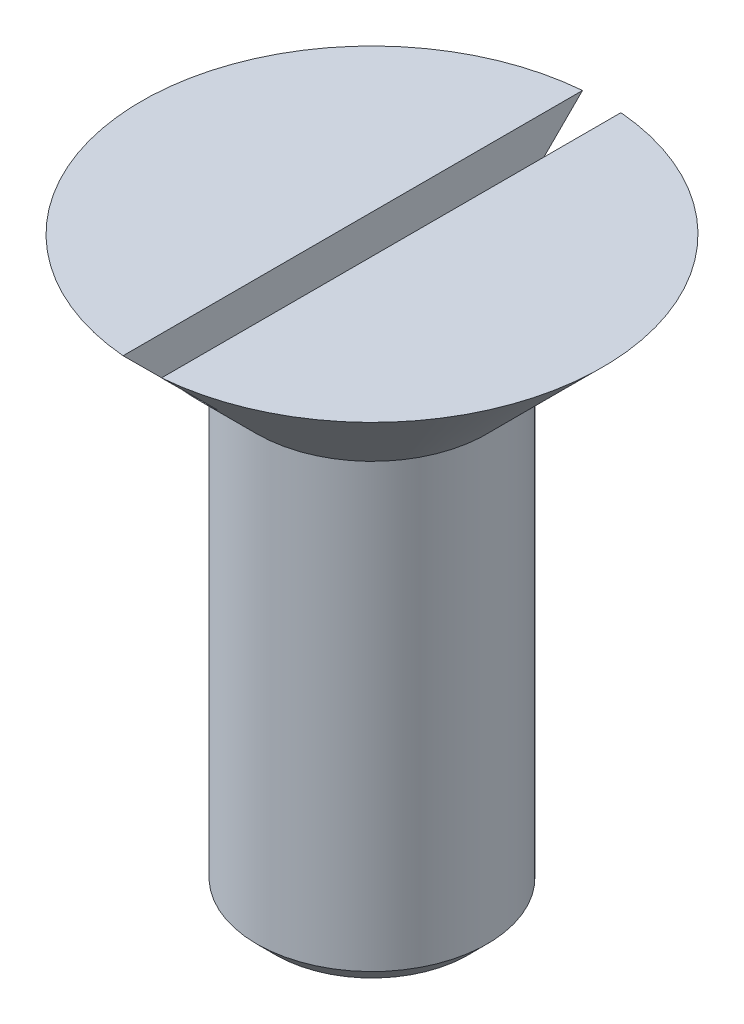
ISO-10303-21;
HEADER;
FILE_DESCRIPTION(('STEP AP214'),'2;1');
FILE_NAME('part.step','',(''),(''),'','','');
FILE_SCHEMA(('AUTOMOTIVE_DESIGN { 1 0 10303 214 1 1 1 1 }'));
ENDSEC;
DATA;
#1=APPLICATION_CONTEXT('core data for automotive mechanical design processes');
#2=APPLICATION_PROTOCOL_DEFINITION('international standard','automotive_design',2000,#1);
#3=PRODUCT_CONTEXT('',#1,'mechanical');
#4=PRODUCT('Part','Part','',(#3));
#5=PRODUCT_RELATED_PRODUCT_CATEGORY('part','',(#4));
#6=PRODUCT_DEFINITION_FORMATION('','',#4);
#7=PRODUCT_DEFINITION_CONTEXT('part definition',#1,'design');
#8=PRODUCT_DEFINITION('design','',#6,#7);
#9=PRODUCT_DEFINITION_SHAPE('','',#8);
#10=(LENGTH_UNIT() NAMED_UNIT(*) SI_UNIT(.MILLI.,.METRE.));
#11=(NAMED_UNIT(*) PLANE_ANGLE_UNIT() SI_UNIT($,.RADIAN.));
#12=(NAMED_UNIT(*) SI_UNIT($,.STERADIAN.) SOLID_ANGLE_UNIT());
#13=UNCERTAINTY_MEASURE_WITH_UNIT(LENGTH_MEASURE(1.E-05),#10,'distance_accuracy_value','');
#14=(GEOMETRIC_REPRESENTATION_CONTEXT(3) GLOBAL_UNCERTAINTY_ASSIGNED_CONTEXT((#13)) GLOBAL_UNIT_ASSIGNED_CONTEXT((#10,
#11,#12)) REPRESENTATION_CONTEXT('',''));
#15=CARTESIAN_POINT('',(0.,0.,0.));
#16=DIRECTION('',(0.,0.,1.));
#17=DIRECTION('',(1.,0.,0.));
#18=AXIS2_PLACEMENT_3D('',#15,#16,#17);
#19=CARTESIAN_POINT('',(12.,30.,0.));
#20=DIRECTION('',(0.,-1.,0.));
#21=DIRECTION('',(0.,0.,-1.));
#22=AXIS2_PLACEMENT_3D('',#19,#20,#21);
#23=PLANE('',#22);
#24=CARTESIAN_POINT('',(0.,30.,0.));
#25=DIRECTION('',(0.,1.,0.));
#26=DIRECTION('',(0.,0.,1.));
#27=AXIS2_PLACEMENT_3D('',#24,#25,#26);
#28=CIRCLE('',#27,12.);
#29=CARTESIAN_POINT('',(1.,30.,11.9582607431014));
#30=VERTEX_POINT('',#29);
#31=CARTESIAN_POINT('',(1.,30.,-11.9582607431014));
#32=VERTEX_POINT('',#31);
#33=EDGE_CURVE('E138',#30,#32,#28,.T.);
#34=ORIENTED_EDGE('',*,*,#33,.T.);
#35=DIRECTION('',(0.,0.,1.));
#36=VECTOR('',#35,1.);
#37=CARTESIAN_POINT('',(1.,30.,0.));
#38=LINE('',#37,#36);
#39=EDGE_CURVE('E139',#32,#30,#38,.T.);
#40=ORIENTED_EDGE('',*,*,#39,.T.);
#41=EDGE_LOOP('',(#34,#40));
#42=FACE_BOUND('',#41,.T.);
#43=ADVANCED_FACE('F37',(#42),#23,.F.);
#44=CARTESIAN_POINT('',(0.,0.,0.));
#45=DIRECTION('',(0.,1.,0.));
#46=DIRECTION('',(0.,0.,1.));
#47=AXIS2_PLACEMENT_3D('',#44,#45,#46);
#48=PLANE('',#47);
#49=CARTESIAN_POINT('',(0.,0.,0.));
#50=DIRECTION('',(0.,1.,0.));
#51=DIRECTION('',(0.,0.,1.));
#52=AXIS2_PLACEMENT_3D('',#49,#50,#51);
#53=CIRCLE('',#52,5.);
#54=CARTESIAN_POINT('',(0.,0.,5.));
#55=VERTEX_POINT('',#54);
#56=EDGE_CURVE('E147',#55,#55,#53,.T.);
#57=ORIENTED_EDGE('',*,*,#56,.F.);
#58=EDGE_LOOP('',(#57));
#59=FACE_BOUND('',#58,.T.);
#60=ADVANCED_FACE('F39',(#59),#48,.F.);
#61=CARTESIAN_POINT('',(0.,0.,0.));
#62=DIRECTION('',(0.,1.,0.));
#63=DIRECTION('',(0.,0.,1.));
#64=AXIS2_PLACEMENT_3D('',#61,#62,#63);
#65=CONICAL_SURFACE('',#64,5.,0.78539816339745);
#66=CARTESIAN_POINT('',(0.,0.999999999999997,0.));
#67=DIRECTION('',(0.,1.,0.));
#68=DIRECTION('',(0.,0.,1.));
#69=AXIS2_PLACEMENT_3D('',#66,#67,#68);
#70=CIRCLE('',#69,6.);
#71=CARTESIAN_POINT('',(0.,0.999999999999997,6.));
#72=VERTEX_POINT('',#71);
#73=EDGE_CURVE('E142',#72,#72,#70,.T.);
#74=ORIENTED_EDGE('',*,*,#73,.F.);
#75=EDGE_LOOP('',(#74));
#76=FACE_BOUND('',#75,.T.);
#77=ORIENTED_EDGE('',*,*,#56,.T.);
#78=EDGE_LOOP('',(#77));
#79=FACE_BOUND('',#78,.T.);
#80=ADVANCED_FACE('F134',(#76,#79),#65,.T.);
#81=CARTESIAN_POINT('',(0.,23.3312882009808,0.));
#82=DIRECTION('',(0.,1.,0.));
#83=DIRECTION('',(0.,0.,1.));
#84=AXIS2_PLACEMENT_3D('',#81,#82,#83);
#85=CYLINDRICAL_SURFACE('',#84,6.);
#86=CARTESIAN_POINT('',(0.,24.,0.));
#87=DIRECTION('',(0.,1.,0.));
#88=DIRECTION('',(0.,0.,1.));
#89=AXIS2_PLACEMENT_3D('',#86,#87,#88);
#90=CIRCLE('',#89,6.);
#91=CARTESIAN_POINT('',(0.,24.,6.));
#92=VERTEX_POINT('',#91);
#93=EDGE_CURVE('E140',#92,#92,#90,.T.);
#94=ORIENTED_EDGE('',*,*,#93,.F.);
#95=EDGE_LOOP('',(#94));
#96=FACE_BOUND('',#95,.T.);
#97=ORIENTED_EDGE('',*,*,#73,.T.);
#98=EDGE_LOOP('',(#97));
#99=FACE_BOUND('',#98,.T.);
#100=ADVANCED_FACE('F127',(#96,#99),#85,.T.);
#101=CARTESIAN_POINT('',(0.,24.,0.));
#102=DIRECTION('',(0.,1.,0.));
#103=DIRECTION('',(0.,0.,1.));
#104=AXIS2_PLACEMENT_3D('',#101,#102,#103);
#105=CONICAL_SURFACE('',#104,6.,0.785398163397449);
#106=CARTESIAN_POINT('',(0.,26.9999999999999,0.));
#107=DIRECTION('',(0.,-1.,0.));
#108=DIRECTION('',(0.,0.,-1.));
#109=AXIS2_PLACEMENT_3D('',#106,#107,#108);
#110=CIRCLE('',#109,8.99999999999995);
#111=CARTESIAN_POINT('',(-0.999999999999996,26.9999999999999,-8.94427190999911));
#112=VERTEX_POINT('',#111);
#113=CARTESIAN_POINT('',(1.,26.9999999999999,-8.94427190999911));
#114=VERTEX_POINT('',#113);
#115=EDGE_CURVE('E11',#112,#114,#110,.T.);
#116=ORIENTED_EDGE('',*,*,#115,.T.);
#117=CARTESIAN_POINT('',(1.,44.5122639469374,26.4933980378523));
#118=CARTESIAN_POINT('',(1.,43.5940673393234,25.5745422624374));
#119=CARTESIAN_POINT('',(1.,42.6758997049582,24.6556575279848));
#120=CARTESIAN_POINT('',(1.,40.8396582708122,22.8177903113004));
#121=CARTESIAN_POINT('',(1.,39.9215844712401,21.8988078288601));
#122=CARTESIAN_POINT('',(1.,38.0855245788476,20.0606632205416));
#123=CARTESIAN_POINT('',(1.,37.16753849273,19.1415010879679));
#124=CARTESIAN_POINT('',(1.,35.3317733412843,17.3029739988937));
#125=CARTESIAN_POINT('',(1.,34.4139942755214,16.3836090428273));
#126=CARTESIAN_POINT('',(1.,32.585570047651,14.5513709514414));
#127=CARTESIAN_POINT('',(1.,31.6749224586648,13.6385002384581));
#128=CARTESIAN_POINT('',(1.,30.3093881661313,12.2687524419226));
#129=CARTESIAN_POINT('',(1.,29.8542814312295,11.8120947295176));
#130=CARTESIAN_POINT('',(1.,28.9442781069952,10.8985705407463));
#131=CARTESIAN_POINT('',(1.,28.4893815175277,10.4417040645145));
#132=CARTESIAN_POINT('',(1.,27.5799074902484,9.52768153636842));
#133=CARTESIAN_POINT('',(1.,27.125330043018,9.0705254938286));
#134=CARTESIAN_POINT('',(1.,26.2166490205943,8.15574043477165));
#135=CARTESIAN_POINT('',(1.,25.7625454465733,7.69811141708995));
#136=CARTESIAN_POINT('',(1.,24.8551207880647,6.78208768874798));
#137=CARTESIAN_POINT('',(1.,24.4017996947011,6.32369298689074));
#138=CARTESIAN_POINT('',(1.,23.7229266085605,5.63500968466589));
#139=CARTESIAN_POINT('',(1.,23.4968207902504,5.40526716991698));
#140=CARTESIAN_POINT('',(1.,23.0451520235052,4.94524928125385));
#141=CARTESIAN_POINT('',(1.,22.8195890742807,4.71497390811529));
#142=CARTESIAN_POINT('',(1.,22.4708088310656,4.35762342812966));
#143=CARTESIAN_POINT('',(1.,22.3473017521385,4.23083122805373));
#144=CARTESIAN_POINT('',(1.,22.1006154097381,3.97692756318102));
#145=CARTESIAN_POINT('',(1.,21.9774361471552,3.84981609751893));
#146=CARTESIAN_POINT('',(1.,21.731383489774,3.59504120353356));
#147=CARTESIAN_POINT('',(1.,21.6085105466701,3.46737733846819));
#148=CARTESIAN_POINT('',(1.,21.3633663120308,3.21147487829868));
#149=CARTESIAN_POINT('',(1.,21.241095016984,3.08323628655735));
#150=CARTESIAN_POINT('',(1.,20.9560567371705,2.78233435743568));
#151=CARTESIAN_POINT('',(1.,20.793620767391,2.60935587365856));
#152=CARTESIAN_POINT('',(1.,20.5520854233645,2.3482357162741));
#153=CARTESIAN_POINT('',(1.,20.4720029781814,2.26100520027151));
#154=CARTESIAN_POINT('',(1.,20.3127603456745,2.08571310966559));
#155=CARTESIAN_POINT('',(1.,20.2336001238385,1.99765156638628));
#156=CARTESIAN_POINT('',(1.,20.0499836197682,1.79039743677013));
#157=CARTESIAN_POINT('',(1.,19.9460309566567,1.67075323436282));
#158=CARTESIAN_POINT('',(1.,19.7928293403971,1.48839131247664));
#159=CARTESIAN_POINT('',(1.,19.7420752377372,1.4269411484096));
#160=CARTESIAN_POINT('',(1.,19.642000262526,1.30288796551511));
#161=CARTESIAN_POINT('',(1.,19.5926792538984,1.24028505707218));
#162=CARTESIAN_POINT('',(1.,19.4954962295327,1.11276151334605));
#163=CARTESIAN_POINT('',(1.,19.4476586409835,1.04782213697281));
#164=CARTESIAN_POINT('',(1.,19.3550461484357,0.915632512397718));
#165=CARTESIAN_POINT('',(1.,19.310275351566,0.848379339723447));
#166=CARTESIAN_POINT('',(1.,19.2260192722934,0.711361132062464));
#167=CARTESIAN_POINT('',(1.,19.18649338327,0.641621435872244));
#168=CARTESIAN_POINT('',(1.,19.1154921116261,0.498175629671973));
#169=CARTESIAN_POINT('',(1.,19.0839926663197,0.424482196452061));
#170=CARTESIAN_POINT('',(1.,19.0476300583708,0.313993325305311));
#171=CARTESIAN_POINT('',(1.,19.0375945899258,0.278911283338334));
#172=CARTESIAN_POINT('',(1.,19.0208129544413,0.207957918115154));
#173=CARTESIAN_POINT('',(1.,19.0140662281727,0.172086730133077));
#174=CARTESIAN_POINT('',(1.,19.004363457367,0.100050123452354));
#175=CARTESIAN_POINT('',(1.,19.0013842852831,0.0638878849152617));
#176=CARTESIAN_POINT('',(1.,18.999381190255,-0.00854813307009095));
#177=CARTESIAN_POINT('',(1.,19.0003571813195,-0.0448219100761998));
#178=CARTESIAN_POINT('',(1.,19.0061730604619,-0.116929805254866));
#179=CARTESIAN_POINT('',(1.,19.0110001422585,-0.152764981592855));
#180=CARTESIAN_POINT('',(1.,19.0241402492626,-0.22379366627047));
#181=CARTESIAN_POINT('',(1.,19.0324548759368,-0.25898687206275));
#182=CARTESIAN_POINT('',(1.,19.0521263437441,-0.328787703379432));
#183=CARTESIAN_POINT('',(1.,19.0635058711954,-0.363388828147075));
#184=CARTESIAN_POINT('',(1.,19.0887270009758,-0.431662326764903));
#185=CARTESIAN_POINT('',(1.,19.1025682804305,-0.465334821742571));
#186=CARTESIAN_POINT('',(1.,19.1424379583776,-0.554704389981399));
#187=CARTESIAN_POINT('',(1.,19.170290333258,-0.60958356182487));
#188=CARTESIAN_POINT('',(1.,19.2298111799644,-0.717249990962887));
#189=CARTESIAN_POINT('',(1.,19.2614837192281,-0.770034937606014));
#190=CARTESIAN_POINT('',(1.,19.3275623880855,-0.87409393416941));
#191=CARTESIAN_POINT('',(1.,19.3619771780003,-0.925362434798085));
#192=CARTESIAN_POINT('',(1.,19.4326829016185,-1.0265917044921));
#193=CARTESIAN_POINT('',(1.,19.4689741960192,-1.07655221933853));
#194=CARTESIAN_POINT('',(1.,19.5432394935988,-1.17587566379117));
#195=CARTESIAN_POINT('',(1.,19.5812253203013,-1.2252297089592));
#196=CARTESIAN_POINT('',(1.,19.658235671145,-1.32312417447184));
#197=CARTESIAN_POINT('',(1.,19.6972602832866,-1.37166452531326));
#198=CARTESIAN_POINT('',(1.,19.7760100557418,-1.46798454694047));
#199=CARTESIAN_POINT('',(1.,19.8157333850879,-1.5157657185965));
#200=CARTESIAN_POINT('',(1.,19.8957954344658,-1.6108052751583));
#201=CARTESIAN_POINT('',(1.,19.9361341299297,-1.65806368080582));
#202=CARTESIAN_POINT('',(1.,20.0561056646744,-1.79715119283996));
#203=CARTESIAN_POINT('',(1.,20.1364265477202,-1.88838642081419));
#204=CARTESIAN_POINT('',(1.,20.2983073403543,-2.0697526189628));
#205=CARTESIAN_POINT('',(1.,20.3798673064283,-2.15988353845498));
#206=CARTESIAN_POINT('',(1.,20.5438704770979,-2.3393601492056));
#207=CARTESIAN_POINT('',(1.,20.6263138029372,-2.42870572952949));
#208=CARTESIAN_POINT('',(1.,20.7918378936183,-2.60680495031919));
#209=CARTESIAN_POINT('',(1.,20.8749186642786,-2.69555858536801));
#210=CARTESIAN_POINT('',(1.,21.1250661629429,-2.96136222832227));
#211=CARTESIAN_POINT('',(1.,21.2928431500977,-3.13774336620005));
#212=CARTESIAN_POINT('',(1.,21.6295165609184,-3.4894026241335));
#213=CARTESIAN_POINT('',(1.,21.7984128913224,-3.66468083376913));
#214=CARTESIAN_POINT('',(1.,22.1356060485038,-4.01312202168835));
#215=CARTESIAN_POINT('',(1.,22.3038969532967,-4.18629073373057));
#216=CARTESIAN_POINT('',(1.,22.6409892285294,-4.53213738180875));
#217=CARTESIAN_POINT('',(1.,22.8097906098032,-4.70481530727551));
#218=CARTESIAN_POINT('',(1.,23.1476739222664,-5.04972721960484));
#219=CARTESIAN_POINT('',(1.,23.3167556710289,-5.22196138523801));
#220=CARTESIAN_POINT('',(1.,23.6551898093395,-5.56616114022082));
#221=CARTESIAN_POINT('',(1.,23.8245421969778,-5.73812673144893));
#222=CARTESIAN_POINT('',(1.,24.3333459132523,-6.25416672060768));
#223=CARTESIAN_POINT('',(1.,24.6731052306043,-6.59793740690343));
#224=CARTESIAN_POINT('',(1.,25.3531311327547,-7.28497678719917));
#225=CARTESIAN_POINT('',(1.,25.6933977178894,-7.62824548086605));
#226=CARTESIAN_POINT('',(1.,26.7146966961912,-8.65756187335986));
#227=CARTESIAN_POINT('',(1.,27.3962254524402,-9.34311699027212));
#228=CARTESIAN_POINT('',(1.,28.7600661400037,-10.7137045598964));
#229=CARTESIAN_POINT('',(1.,29.4423781947668,-11.3987368896728));
#230=CARTESIAN_POINT('',(1.,30.8073886273179,-12.7684141820932));
#231=CARTESIAN_POINT('',(1.,31.4900870044345,-13.4530591454065));
#232=CARTESIAN_POINT('',(1.,32.857424926936,-14.8238118400087));
#233=CARTESIAN_POINT('',(1.,33.5420650744256,-15.509918970583));
#234=CARTESIAN_POINT('',(1.,34.9115092744228,-16.8819702613872));
#235=CARTESIAN_POINT('',(1.,35.5963133270055,-17.5679144215421));
#236=CARTESIAN_POINT('',(1.,37.6508318487785,-19.6255164705086));
#237=CARTESIAN_POINT('',(1.,39.0207147723336,-20.9970061520943));
#238=CARTESIAN_POINT('',(1.,40.7343175499149,-22.7123185156788));
#239=CARTESIAN_POINT('',(1.,41.0779249219648,-23.0562535878216));
#240=CARTESIAN_POINT('',(1.,41.7651562399893,-23.7441123588834));
#241=CARTESIAN_POINT('',(1.,42.1087801860695,-24.0880360576969));
#242=CARTESIAN_POINT('',(1.,42.795709258705,-24.7755402323958));
#243=CARTESIAN_POINT('',(1.,43.1390143736453,-25.1191207198867));
#244=CARTESIAN_POINT('',(1.,43.8256327400497,-25.8062683844045));
#245=CARTESIAN_POINT('',(1.,44.1689459914329,-26.1498355615123));
#246=CARTESIAN_POINT('',(1.,44.5122639469374,-26.4933980378523));
#247=B_SPLINE_CURVE_WITH_KNOTS('',3,(#117,#118,#119,#120,#121,#122,#123,#124,#125,#126,#127,
#128,#129,#130,#131,#132,#133,#134,#135,#136,#137,#138,#139,#140,#141,#142,#143,#144,#145,#146,
#147,#148,#149,#150,#151,#152,#153,#154,#155,#156,#157,#158,#159,#160,#161,#162,#163,#164,#165,
#166,#167,#168,#169,#170,#171,#172,#173,#174,#175,#176,#177,#178,#179,#180,#181,#182,#183,#184,
#185,#186,#187,#188,#189,#190,#191,#192,#193,#194,#195,#196,#197,#198,#199,#200,#201,#202,#203,
#204,#205,#206,#207,#208,#209,#210,#211,#212,#213,#214,#215,#216,#217,#218,#219,#220,#221,#222,
#223,#224,#225,#226,#227,#228,#229,#230,#231,#232,#233,#234,#235,#236,#237,#238,#239,#240,#241,
#242,#243,#244,#245,#246),.UNSPECIFIED.,.F.,.F.,(4,2,2,2,2,2,2,2,2,2,2,2,2,2,2,2,2,2,2,2,2,2,2,
2,2,2,2,2,2,2,2,2,2,2,2,2,2,2,2,2,2,2,2,2,2,2,2,2,2,2,2,2,2,2,2,2,2,2,2,2,2,2,2,2,4),(0.,
3.89697684921333,7.79396218219167,11.6911428473207,15.5883152529976,19.4565844210246,
21.3907316407715,23.3248776163606,25.2589638856351,27.193054928485,29.1271238861621,
30.0941544941738,31.0611836954061,31.5921939251933,32.1232055957292,32.6547698595058,
33.1863310170759,33.8981855550178,34.2534281054231,34.6086573186869,35.0840811226979,
35.3231669902748,35.5622300813102,35.8041453579361,36.0463785237713,36.2866106904624,
36.5261139530371,36.6354528059225,36.7447730599531,36.8534189294717,36.9620624368749,
37.070346163342,37.1786796677949,37.2878382064007,37.3969824387214,37.58136193551,
37.765939508726,37.9511250465151,38.1363463135362,38.3231668485657,38.5100032607269,
38.6964071345393,38.8828035856994,39.2474451436095,39.6121033745138,39.9768123137942,
40.3415245860213,41.0718121943909,41.8020397026218,42.5264572248302,43.2508902311102,
43.9749610989488,44.6990268796318,46.1490369306489,47.5990479434127,50.4990821735532,
53.3996632608022,56.3002393217377,59.2080350442504,62.1158320999668,67.9311625001481,
69.3896604405071,70.8481693847268,72.305273903775,73.7623674296813),.UNSPECIFIED.);
#248=EDGE_CURVE('E95',#114,#32,#247,.T.);
#249=ORIENTED_EDGE('',*,*,#248,.T.);
#250=ORIENTED_EDGE('',*,*,#33,.F.);
#251=CARTESIAN_POINT('',(1.,26.9999999999999,8.94427190999911));
#252=VERTEX_POINT('',#251);
#253=EDGE_CURVE('E60',#30,#252,#247,.T.);
#254=ORIENTED_EDGE('',*,*,#253,.T.);
#255=CARTESIAN_POINT('',(-0.999999999999996,26.9999999999999,8.94427190999911));
#256=VERTEX_POINT('',#255);
#257=EDGE_CURVE('E41',#252,#256,#110,.T.);
#258=ORIENTED_EDGE('',*,*,#257,.T.);
#259=CARTESIAN_POINT('',(-0.999999999999994,44.5122639469374,-26.4933980378523));
#260=CARTESIAN_POINT('',(-0.999999999999994,43.5940673393234,-25.5745422624374));
#261=CARTESIAN_POINT('',(-0.999999999999994,42.6758997049582,-24.6556575279848));
#262=CARTESIAN_POINT('',(-0.999999999999994,40.8396582708122,-22.8177903113004));
#263=CARTESIAN_POINT('',(-0.999999999999994,39.9215844712401,-21.8988078288601));
#264=CARTESIAN_POINT('',(-0.999999999999994,38.0855245788476,-20.0606632205416));
#265=CARTESIAN_POINT('',(-0.999999999999994,37.1675384927301,-19.1415010879679));
#266=CARTESIAN_POINT('',(-0.999999999999995,35.3317733412843,-17.3029739988937));
#267=CARTESIAN_POINT('',(-0.999999999999995,34.4139942755214,-16.3836090428273));
#268=CARTESIAN_POINT('',(-0.999999999999995,32.585570047651,-14.5513709514414));
#269=CARTESIAN_POINT('',(-0.999999999999995,31.6749224586648,-13.6385002384581));
#270=CARTESIAN_POINT('',(-0.999999999999995,30.3093881661313,-12.2687524419226));
#271=CARTESIAN_POINT('',(-0.999999999999995,29.8542814312295,-11.8120947295176));
#272=CARTESIAN_POINT('',(-0.999999999999995,28.9442781069952,-10.8985705407463));
#273=CARTESIAN_POINT('',(-0.999999999999995,28.4893815175277,-10.4417040645145));
#274=CARTESIAN_POINT('',(-0.999999999999995,27.5799074902484,-9.52768153636842));
#275=CARTESIAN_POINT('',(-0.999999999999996,27.125330043018,-9.0705254938286));
#276=CARTESIAN_POINT('',(-0.999999999999996,26.2166490205943,-8.15574043477166));
#277=CARTESIAN_POINT('',(-0.999999999999996,25.7625454465734,-7.69811141708996));
#278=CARTESIAN_POINT('',(-0.999999999999996,24.8551207880647,-6.78208768874798));
#279=CARTESIAN_POINT('',(-0.999999999999996,24.4017996947011,-6.32369298689074));
#280=CARTESIAN_POINT('',(-0.999999999999996,23.7229266085605,-5.6350096846659));
#281=CARTESIAN_POINT('',(-0.999999999999996,23.4968207902504,-5.40526716991699));
#282=CARTESIAN_POINT('',(-0.999999999999996,23.0451520235052,-4.94524928125386));
#283=CARTESIAN_POINT('',(-0.999999999999996,22.8195890742807,-4.71497390811529));
#284=CARTESIAN_POINT('',(-0.999999999999996,22.4708088310656,-4.35762342812966));
#285=CARTESIAN_POINT('',(-0.999999999999996,22.3473017521385,-4.23083122805374));
#286=CARTESIAN_POINT('',(-0.999999999999996,22.1006154097381,-3.97692756318103));
#287=CARTESIAN_POINT('',(-0.999999999999996,21.9774361471552,-3.84981609751894));
#288=CARTESIAN_POINT('',(-0.999999999999996,21.731383489774,-3.59504120353357));
#289=CARTESIAN_POINT('',(-0.999999999999996,21.6085105466701,-3.4673773384682));
#290=CARTESIAN_POINT('',(-0.999999999999996,21.3633663120308,-3.21147487829869));
#291=CARTESIAN_POINT('',(-0.999999999999996,21.241095016984,-3.08323628655735));
#292=CARTESIAN_POINT('',(-0.999999999999996,20.9560567371705,-2.78233435743569));
#293=CARTESIAN_POINT('',(-0.999999999999996,20.793620767391,-2.60935587365856));
#294=CARTESIAN_POINT('',(-0.999999999999996,20.5520854233645,-2.3482357162741));
#295=CARTESIAN_POINT('',(-0.999999999999996,20.4720029781814,-2.26100520027152));
#296=CARTESIAN_POINT('',(-0.999999999999996,20.3127603456745,-2.0857131096656));
#297=CARTESIAN_POINT('',(-0.999999999999996,20.2336001238385,-1.99765156638628));
#298=CARTESIAN_POINT('',(-0.999999999999996,20.0499836197682,-1.79039743677013));
#299=CARTESIAN_POINT('',(-0.999999999999997,19.9460309566567,-1.67075323436283));
#300=CARTESIAN_POINT('',(-0.999999999999997,19.7928293403971,-1.48839131247665));
#301=CARTESIAN_POINT('',(-0.999999999999997,19.7420752377373,-1.42694114840961));
#302=CARTESIAN_POINT('',(-0.999999999999997,19.642000262526,-1.30288796551512));
#303=CARTESIAN_POINT('',(-0.999999999999997,19.5926792538984,-1.24028505707219));
#304=CARTESIAN_POINT('',(-0.999999999999997,19.4954962295326,-1.11276151334605));
#305=CARTESIAN_POINT('',(-0.999999999999997,19.4476586409835,-1.04782213697281));
#306=CARTESIAN_POINT('',(-0.999999999999997,19.3550461484357,-0.91563251239772));
#307=CARTESIAN_POINT('',(-0.999999999999997,19.310275351566,-0.84837933972345));
#308=CARTESIAN_POINT('',(-0.999999999999997,19.2260192722934,-0.711361132062467));
#309=CARTESIAN_POINT('',(-0.999999999999997,19.18649338327,-0.641621435872249));
#310=CARTESIAN_POINT('',(-0.999999999999997,19.1154921116261,-0.498175629671979));
#311=CARTESIAN_POINT('',(-0.999999999999997,19.0839926663197,-0.424482196452067));
#312=CARTESIAN_POINT('',(-0.999999999999997,19.0476300583708,-0.313993325305314));
#313=CARTESIAN_POINT('',(-0.999999999999997,19.0375945899258,-0.278911283338336));
#314=CARTESIAN_POINT('',(-0.999999999999997,19.0208129544413,-0.207957918115156));
#315=CARTESIAN_POINT('',(-0.999999999999997,19.0140662281727,-0.172086730133082));
#316=CARTESIAN_POINT('',(-0.999999999999997,19.004363457367,-0.100050123452361));
#317=CARTESIAN_POINT('',(-0.999999999999997,19.0013842852831,-0.0638878849152681));
#318=CARTESIAN_POINT('',(-0.999999999999997,18.999381190255,0.0085481330700844));
#319=CARTESIAN_POINT('',(-0.999999999999997,19.0003571813195,0.0448219100761931));
#320=CARTESIAN_POINT('',(-0.999999999999997,19.0061730604619,0.116929805254857));
#321=CARTESIAN_POINT('',(-0.999999999999997,19.0110001422585,0.152764981592844));
#322=CARTESIAN_POINT('',(-0.999999999999997,19.0241402492626,0.223793666270459));
#323=CARTESIAN_POINT('',(-0.999999999999997,19.0324548759367,0.258986872062742));
#324=CARTESIAN_POINT('',(-0.999999999999997,19.0521263437441,0.328787703379424));
#325=CARTESIAN_POINT('',(-0.999999999999997,19.0635058711954,0.363388828147065));
#326=CARTESIAN_POINT('',(-0.999999999999997,19.0887270009758,0.431662326764892));
#327=CARTESIAN_POINT('',(-0.999999999999997,19.1025682804305,0.465334821742563));
#328=CARTESIAN_POINT('',(-0.999999999999997,19.1424379583776,0.554704389981392));
#329=CARTESIAN_POINT('',(-0.999999999999997,19.170290333258,0.609583561824863));
#330=CARTESIAN_POINT('',(-0.999999999999997,19.2298111799644,0.71724999096288));
#331=CARTESIAN_POINT('',(-0.999999999999997,19.2614837192281,0.770034937606007));
#332=CARTESIAN_POINT('',(-0.999999999999997,19.3275623880855,0.874093934169407));
#333=CARTESIAN_POINT('',(-0.999999999999997,19.3619771780003,0.925362434798085));
#334=CARTESIAN_POINT('',(-0.999999999999997,19.4326829016185,1.0265917044921));
#335=CARTESIAN_POINT('',(-0.999999999999997,19.4689741960192,1.07655221933852));
#336=CARTESIAN_POINT('',(-0.999999999999997,19.5432394935988,1.17587566379116));
#337=CARTESIAN_POINT('',(-0.999999999999997,19.5812253203013,1.22522970895918));
#338=CARTESIAN_POINT('',(-0.999999999999997,19.658235671145,1.32312417447182));
#339=CARTESIAN_POINT('',(-0.999999999999997,19.6972602832865,1.37166452531325));
#340=CARTESIAN_POINT('',(-0.999999999999997,19.7760100557418,1.46798454694046));
#341=CARTESIAN_POINT('',(-0.999999999999997,19.8157333850878,1.51576571859648));
#342=CARTESIAN_POINT('',(-0.999999999999997,19.8957954344658,1.61080527515828));
#343=CARTESIAN_POINT('',(-0.999999999999997,19.9361341299296,1.6580636808058));
#344=CARTESIAN_POINT('',(-0.999999999999997,20.0561056646744,1.79715119283994));
#345=CARTESIAN_POINT('',(-0.999999999999996,20.1364265477202,1.88838642081416));
#346=CARTESIAN_POINT('',(-0.999999999999996,20.2983073403543,2.06975261896277));
#347=CARTESIAN_POINT('',(-0.999999999999996,20.3798673064283,2.15988353845494));
#348=CARTESIAN_POINT('',(-0.999999999999996,20.5438704770979,2.33936014920556));
#349=CARTESIAN_POINT('',(-0.999999999999996,20.6263138029371,2.42870572952946));
#350=CARTESIAN_POINT('',(-0.999999999999996,20.7918378936182,2.60680495031915));
#351=CARTESIAN_POINT('',(-0.999999999999996,20.8749186642785,2.69555858536797));
#352=CARTESIAN_POINT('',(-0.999999999999996,21.1250661629429,2.96136222832222));
#353=CARTESIAN_POINT('',(-0.999999999999996,21.2928431500976,3.13774336620001));
#354=CARTESIAN_POINT('',(-0.999999999999996,21.6295165609184,3.48940262413345));
#355=CARTESIAN_POINT('',(-0.999999999999996,21.7984128913223,3.66468083376908));
#356=CARTESIAN_POINT('',(-0.999999999999996,22.1356060485037,4.0131220216883));
#357=CARTESIAN_POINT('',(-0.999999999999996,22.3038969532967,4.18629073373051));
#358=CARTESIAN_POINT('',(-0.999999999999996,22.6409892285293,4.53213738180869));
#359=CARTESIAN_POINT('',(-0.999999999999996,22.8097906098032,4.70481530727544));
#360=CARTESIAN_POINT('',(-0.999999999999996,23.1476739222664,5.04972721960477));
#361=CARTESIAN_POINT('',(-0.999999999999996,23.3167556710288,5.22196138523793));
#362=CARTESIAN_POINT('',(-0.999999999999996,23.6551898093394,5.56616114022075));
#363=CARTESIAN_POINT('',(-0.999999999999996,23.8245421969778,5.73812673144885));
#364=CARTESIAN_POINT('',(-0.999999999999996,24.3333459132522,6.25416672060759));
#365=CARTESIAN_POINT('',(-0.999999999999996,24.6731052306042,6.59793740690334));
#366=CARTESIAN_POINT('',(-0.999999999999996,25.3531311327546,7.28497678719906));
#367=CARTESIAN_POINT('',(-0.999999999999996,25.6933977178893,7.62824548086594));
#368=CARTESIAN_POINT('',(-0.999999999999995,26.7146966961911,8.65756187335973));
#369=CARTESIAN_POINT('',(-0.999999999999995,27.3962254524401,9.34311699027198));
#370=CARTESIAN_POINT('',(-0.999999999999995,28.7600661400035,10.7137045598962));
#371=CARTESIAN_POINT('',(-0.999999999999995,29.4423781947666,11.3987368896726));
#372=CARTESIAN_POINT('',(-0.999999999999995,30.8073886273177,12.7684141820931));
#373=CARTESIAN_POINT('',(-0.999999999999995,31.4900870044343,13.4530591454063));
#374=CARTESIAN_POINT('',(-0.999999999999995,32.8574249269358,14.8238118400085));
#375=CARTESIAN_POINT('',(-0.999999999999995,33.5420650744254,15.5099189705828));
#376=CARTESIAN_POINT('',(-0.999999999999995,34.9115092744226,16.881970261387));
#377=CARTESIAN_POINT('',(-0.999999999999995,35.5963133270052,17.5679144215418));
#378=CARTESIAN_POINT('',(-0.999999999999994,37.6508318487782,19.6255164705084));
#379=CARTESIAN_POINT('',(-0.999999999999994,39.0207147723333,20.997006152094));
#380=CARTESIAN_POINT('',(-0.999999999999994,40.7343175499146,22.7123185156785));
#381=CARTESIAN_POINT('',(-0.999999999999994,41.0779249219645,23.0562535878213));
#382=CARTESIAN_POINT('',(-0.999999999999994,41.7651562399891,23.7441123588831));
#383=CARTESIAN_POINT('',(-0.999999999999994,42.1087801860693,24.0880360576967));
#384=CARTESIAN_POINT('',(-0.999999999999994,42.7957092587048,24.7755402323956));
#385=CARTESIAN_POINT('',(-0.999999999999994,43.1390143736451,25.1191207198866));
#386=CARTESIAN_POINT('',(-0.999999999999994,43.8256327400496,25.8062683844045));
#387=CARTESIAN_POINT('',(-0.999999999999994,44.1689459914328,26.1498355615122));
#388=CARTESIAN_POINT('',(-0.999999999999994,44.5122639469374,26.4933980378523));
#389=B_SPLINE_CURVE_WITH_KNOTS('',3,(#259,#260,#261,#262,#263,#264,#265,#266,#267,#268,#269,
#270,#271,#272,#273,#274,#275,#276,#277,#278,#279,#280,#281,#282,#283,#284,#285,#286,#287,#288,
#289,#290,#291,#292,#293,#294,#295,#296,#297,#298,#299,#300,#301,#302,#303,#304,#305,#306,#307,
#308,#309,#310,#311,#312,#313,#314,#315,#316,#317,#318,#319,#320,#321,#322,#323,#324,#325,#326,
#327,#328,#329,#330,#331,#332,#333,#334,#335,#336,#337,#338,#339,#340,#341,#342,#343,#344,#345,
#346,#347,#348,#349,#350,#351,#352,#353,#354,#355,#356,#357,#358,#359,#360,#361,#362,#363,#364,
#365,#366,#367,#368,#369,#370,#371,#372,#373,#374,#375,#376,#377,#378,#379,#380,#381,#382,#383,
#384,#385,#386,#387,#388),.UNSPECIFIED.,.F.,.F.,(4,2,2,2,2,2,2,2,2,2,2,2,2,2,2,2,2,2,2,2,2,2,2,
2,2,2,2,2,2,2,2,2,2,2,2,2,2,2,2,2,2,2,2,2,2,2,2,2,2,2,2,2,2,2,2,2,2,2,2,2,2,2,2,2,4),(0.,
3.89697684921333,7.79396218219166,11.6911428473207,15.5883152529976,19.4565844210246,
21.3907316407715,23.3248776163606,25.2589638856351,27.1930549284849,29.1271238861621,
30.0941544941738,31.0611836954061,31.5921939251933,32.1232055957292,32.6547698595058,
33.1863310170759,33.8981855550177,34.2534281054231,34.6086573186869,35.0840811226979,
35.3231669902748,35.5622300813102,35.8041453579361,36.0463785237713,36.2866106904624,
36.5261139530371,36.6354528059225,36.7447730599531,36.8534189294717,36.9620624368749,
37.070346163342,37.1786796677949,37.2878382064007,37.3969824387214,37.58136193551,
37.765939508726,37.9511250465151,38.1363463135362,38.3231668485657,38.5100032607269,
38.6964071345393,38.8828035856994,39.2474451436094,39.6121033745137,39.9768123137941,
40.3415245860212,41.0718121943908,41.8020397026218,42.5264572248301,43.2508902311101,
43.9749610989487,44.6990268796317,46.1490369306487,47.5990479434125,50.499082173553,
53.399663260802,56.3002393217374,59.2080350442501,62.1158320999665,67.9311625001476,
69.3896604405067,70.8481693847265,72.3052739037749,73.7623674296812),.UNSPECIFIED.);
#390=CARTESIAN_POINT('',(-0.999999999999996,30.,11.9582607431014));
#391=VERTEX_POINT('',#390);
#392=EDGE_CURVE('E88',#256,#391,#389,.T.);
#393=ORIENTED_EDGE('',*,*,#392,.T.);
#394=CARTESIAN_POINT('',(-0.999999999999996,30.,-11.9582607431014));
#395=VERTEX_POINT('',#394);
#396=EDGE_CURVE('E94',#395,#391,#28,.T.);
#397=ORIENTED_EDGE('',*,*,#396,.F.);
#398=EDGE_CURVE('E52',#395,#112,#389,.T.);
#399=ORIENTED_EDGE('',*,*,#398,.T.);
#400=EDGE_LOOP('',(#116,#249,#250,#254,#258,#393,#397,#399));
#401=FACE_BOUND('',#400,.T.);
#402=ORIENTED_EDGE('',*,*,#93,.T.);
#403=EDGE_LOOP('',(#402));
#404=FACE_BOUND('',#403,.T.);
#405=ADVANCED_FACE('F91',(#401,#404),#105,.T.);
#406=ORIENTED_EDGE('',*,*,#396,.T.);
#407=DIRECTION('',(0.,0.,-1.));
#408=VECTOR('',#407,1.);
#409=CARTESIAN_POINT('',(-0.999999999999996,30.,0.));
#410=LINE('',#409,#408);
#411=EDGE_CURVE('E150',#391,#395,#410,.T.);
#412=ORIENTED_EDGE('',*,*,#411,.T.);
#413=EDGE_LOOP('',(#406,#412));
#414=FACE_BOUND('',#413,.T.);
#415=ADVANCED_FACE('F120',(#414),#23,.F.);
#416=CARTESIAN_POINT('',(-0.999999999999996,26.9999999999999,-12.));
#417=DIRECTION('',(0.,-1.,0.));
#418=DIRECTION('',(0.,0.,-1.));
#419=AXIS2_PLACEMENT_3D('',#416,#417,#418);
#420=PLANE('',#419);
#421=DIRECTION('',(0.,0.,1.));
#422=VECTOR('',#421,1.);
#423=CARTESIAN_POINT('',(1.,26.9999999999999,-12.));
#424=LINE('',#423,#422);
#425=EDGE_CURVE('E83',#114,#252,#424,.T.);
#426=ORIENTED_EDGE('',*,*,#425,.F.);
#427=ORIENTED_EDGE('',*,*,#115,.F.);
#428=DIRECTION('',(0.,0.,1.));
#429=VECTOR('',#428,1.);
#430=CARTESIAN_POINT('',(-0.999999999999996,26.9999999999999,-12.));
#431=LINE('',#430,#429);
#432=EDGE_CURVE('E81',#112,#256,#431,.T.);
#433=ORIENTED_EDGE('',*,*,#432,.T.);
#434=ORIENTED_EDGE('',*,*,#257,.F.);
#435=EDGE_LOOP('',(#426,#427,#433,#434));
#436=FACE_BOUND('',#435,.T.);
#437=ADVANCED_FACE('F80',(#436),#420,.F.);
#438=CARTESIAN_POINT('',(1.,32.9999999999999,-12.));
#439=DIRECTION('',(1.,0.,0.));
#440=DIRECTION('',(0.,1.,0.));
#441=AXIS2_PLACEMENT_3D('',#438,#439,#440);
#442=PLANE('',#441);
#443=ORIENTED_EDGE('',*,*,#39,.F.);
#444=ORIENTED_EDGE('',*,*,#248,.F.);
#445=ORIENTED_EDGE('',*,*,#425,.T.);
#446=ORIENTED_EDGE('',*,*,#253,.F.);
#447=EDGE_LOOP('',(#443,#444,#445,#446));
#448=FACE_BOUND('',#447,.T.);
#449=ADVANCED_FACE('F117',(#448),#442,.F.);
#450=CARTESIAN_POINT('',(-0.999999999999995,32.9999999999999,-12.));
#451=DIRECTION('',(-1.,0.,0.));
#452=DIRECTION('',(0.,-1.,0.));
#453=AXIS2_PLACEMENT_3D('',#450,#451,#452);
#454=PLANE('',#453);
#455=ORIENTED_EDGE('',*,*,#411,.F.);
#456=ORIENTED_EDGE('',*,*,#392,.F.);
#457=ORIENTED_EDGE('',*,*,#432,.F.);
#458=ORIENTED_EDGE('',*,*,#398,.F.);
#459=EDGE_LOOP('',(#455,#456,#457,#458));
#460=FACE_BOUND('',#459,.T.);
#461=ADVANCED_FACE('F86',(#460),#454,.F.);
#462=CLOSED_SHELL('',(#43,#60,#80,#100,#405,#415,#437,#449,#461));
#463=MANIFOLD_SOLID_BREP('B2',#462);
#464=ADVANCED_BREP_SHAPE_REPRESENTATION('',(#18,#463),#14);
#465=SHAPE_DEFINITION_REPRESENTATION(#9,#464);
ENDSEC;
END-ISO-10303-21;
